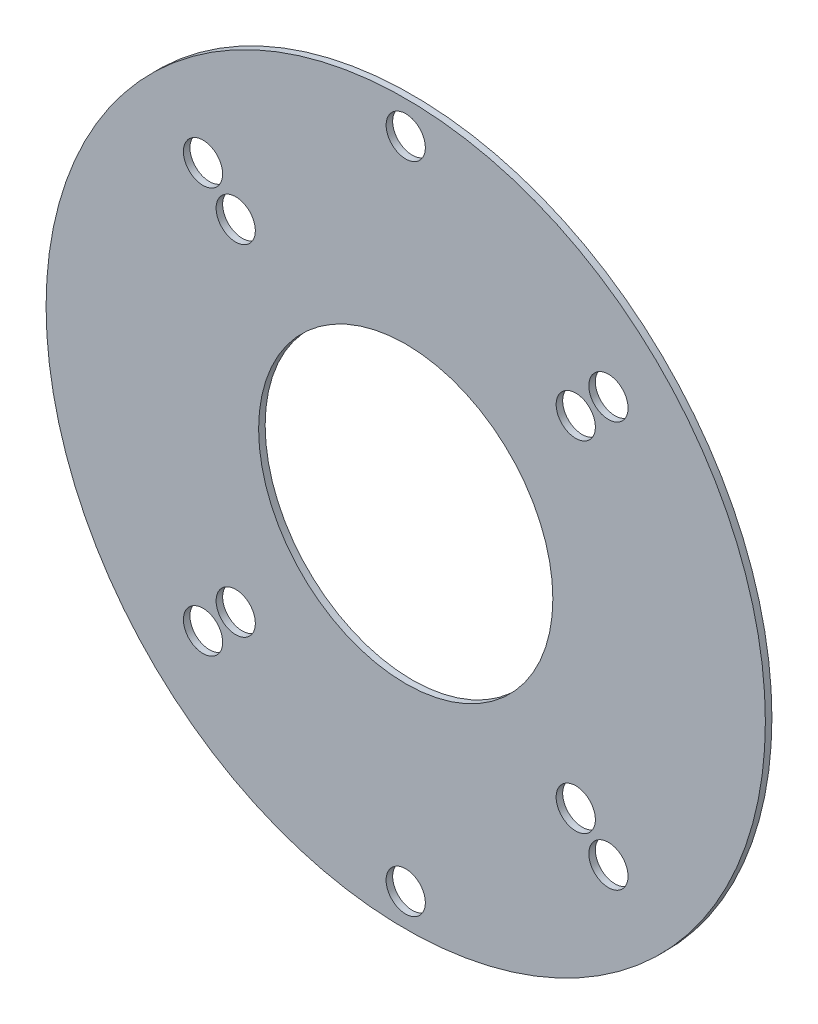
ISO-10303-21;
HEADER;
FILE_DESCRIPTION(('STEP AP214'),'2;1');
FILE_NAME('part.step','',(''),(''),'','','');
FILE_SCHEMA(('AUTOMOTIVE_DESIGN { 1 0 10303 214 1 1 1 1 }'));
ENDSEC;
DATA;
#1=APPLICATION_CONTEXT('core data for automotive mechanical design processes');
#2=APPLICATION_PROTOCOL_DEFINITION('international standard','automotive_design',2000,#1);
#3=PRODUCT_CONTEXT('',#1,'mechanical');
#4=PRODUCT('Part','Part','',(#3));
#5=PRODUCT_RELATED_PRODUCT_CATEGORY('part','',(#4));
#6=PRODUCT_DEFINITION_FORMATION('','',#4);
#7=PRODUCT_DEFINITION_CONTEXT('part definition',#1,'design');
#8=PRODUCT_DEFINITION('design','',#6,#7);
#9=PRODUCT_DEFINITION_SHAPE('','',#8);
#10=(LENGTH_UNIT() NAMED_UNIT(*) SI_UNIT(.MILLI.,.METRE.));
#11=(NAMED_UNIT(*) PLANE_ANGLE_UNIT() SI_UNIT($,.RADIAN.));
#12=(NAMED_UNIT(*) SI_UNIT($,.STERADIAN.) SOLID_ANGLE_UNIT());
#13=UNCERTAINTY_MEASURE_WITH_UNIT(LENGTH_MEASURE(1.E-05),#10,'distance_accuracy_value','');
#14=(GEOMETRIC_REPRESENTATION_CONTEXT(3) GLOBAL_UNCERTAINTY_ASSIGNED_CONTEXT((#13)) GLOBAL_UNIT_ASSIGNED_CONTEXT((#10,
#11,#12)) REPRESENTATION_CONTEXT('',''));
#15=CARTESIAN_POINT('',(0.,0.,0.));
#16=DIRECTION('',(0.,0.,1.));
#17=DIRECTION('',(1.,0.,0.));
#18=AXIS2_PLACEMENT_3D('',#15,#16,#17);
#19=CARTESIAN_POINT('',(0.,0.,-0.5));
#20=DIRECTION('',(0.,0.,1.));
#21=DIRECTION('',(1.,0.,0.));
#22=AXIS2_PLACEMENT_3D('',#19,#20,#21);
#23=PLANE('',#22);
#24=CARTESIAN_POINT('',(0.,-25.,-0.5));
#25=DIRECTION('',(0.,0.,1.));
#26=DIRECTION('',(1.,0.,0.));
#27=AXIS2_PLACEMENT_3D('',#24,#25,#26);
#28=CIRCLE('',#27,1.5);
#29=CARTESIAN_POINT('',(1.5,-25.,-0.5));
#30=VERTEX_POINT('',#29);
#31=EDGE_CURVE('E110',#30,#30,#28,.F.);
#32=ORIENTED_EDGE('',*,*,#31,.F.);
#33=EDGE_LOOP('',(#32));
#34=FACE_BOUND('',#33,.T.);
#35=CARTESIAN_POINT('',(13.,13.,-0.5));
#36=DIRECTION('',(0.,0.,1.));
#37=DIRECTION('',(1.,0.,0.));
#38=AXIS2_PLACEMENT_3D('',#35,#36,#37);
#39=CIRCLE('',#38,1.5);
#40=CARTESIAN_POINT('',(14.5,13.,-0.5));
#41=VERTEX_POINT('',#40);
#42=EDGE_CURVE('E86',#41,#41,#39,.F.);
#43=ORIENTED_EDGE('',*,*,#42,.F.);
#44=EDGE_LOOP('',(#43));
#45=FACE_BOUND('',#44,.T.);
#46=CARTESIAN_POINT('',(0.,0.,-0.5));
#47=DIRECTION('',(0.,0.,1.));
#48=DIRECTION('',(1.,0.,0.));
#49=AXIS2_PLACEMENT_3D('',#46,#47,#48);
#50=CIRCLE('',#49,27.5);
#51=CARTESIAN_POINT('',(27.5,0.,-0.5));
#52=VERTEX_POINT('',#51);
#53=EDGE_CURVE('E11',#52,#52,#50,.T.);
#54=ORIENTED_EDGE('',*,*,#53,.F.);
#55=EDGE_LOOP('',(#54));
#56=FACE_BOUND('',#55,.T.);
#57=CARTESIAN_POINT('',(0.,0.,-0.5));
#58=DIRECTION('',(0.,0.,1.));
#59=DIRECTION('',(1.,0.,0.));
#60=AXIS2_PLACEMENT_3D('',#57,#58,#59);
#61=CIRCLE('',#60,11.25);
#62=CARTESIAN_POINT('',(11.25,0.,-0.5));
#63=VERTEX_POINT('',#62);
#64=EDGE_CURVE('E67',#63,#63,#61,.T.);
#65=ORIENTED_EDGE('',*,*,#64,.T.);
#66=EDGE_LOOP('',(#65));
#67=FACE_BOUND('',#66,.T.);
#68=CARTESIAN_POINT('',(-13.,13.,-0.5));
#69=DIRECTION('',(0.,0.,1.));
#70=DIRECTION('',(1.,0.,0.));
#71=AXIS2_PLACEMENT_3D('',#68,#69,#70);
#72=CIRCLE('',#71,1.5);
#73=CARTESIAN_POINT('',(-11.5,13.,-0.5));
#74=VERTEX_POINT('',#73);
#75=EDGE_CURVE('E74',#74,#74,#72,.T.);
#76=ORIENTED_EDGE('',*,*,#75,.T.);
#77=EDGE_LOOP('',(#76));
#78=FACE_BOUND('',#77,.T.);
#79=CARTESIAN_POINT('',(-13.,-13.,-0.5));
#80=DIRECTION('',(0.,0.,1.));
#81=DIRECTION('',(1.,0.,0.));
#82=AXIS2_PLACEMENT_3D('',#79,#80,#81);
#83=CIRCLE('',#82,1.5);
#84=CARTESIAN_POINT('',(-11.5,-13.,-0.5));
#85=VERTEX_POINT('',#84);
#86=EDGE_CURVE('E80',#85,#85,#83,.F.);
#87=ORIENTED_EDGE('',*,*,#86,.F.);
#88=EDGE_LOOP('',(#87));
#89=FACE_BOUND('',#88,.T.);
#90=CARTESIAN_POINT('',(0.,25.,-0.5));
#91=DIRECTION('',(0.,0.,1.));
#92=DIRECTION('',(1.,0.,0.));
#93=AXIS2_PLACEMENT_3D('',#90,#91,#92);
#94=CIRCLE('',#93,1.5);
#95=CARTESIAN_POINT('',(1.5,25.,-0.5));
#96=VERTEX_POINT('',#95);
#97=EDGE_CURVE('E92',#96,#96,#94,.T.);
#98=ORIENTED_EDGE('',*,*,#97,.T.);
#99=EDGE_LOOP('',(#98));
#100=FACE_BOUND('',#99,.T.);
#101=CARTESIAN_POINT('',(-15.5,15.5,-0.5));
#102=DIRECTION('',(0.,0.,1.));
#103=DIRECTION('',(1.,0.,0.));
#104=AXIS2_PLACEMENT_3D('',#101,#102,#103);
#105=CIRCLE('',#104,1.5);
#106=CARTESIAN_POINT('',(-14.,15.5,-0.5));
#107=VERTEX_POINT('',#106);
#108=EDGE_CURVE('E98',#107,#107,#105,.T.);
#109=ORIENTED_EDGE('',*,*,#108,.T.);
#110=EDGE_LOOP('',(#109));
#111=FACE_BOUND('',#110,.T.);
#112=CARTESIAN_POINT('',(-15.5,-15.5,-0.5));
#113=DIRECTION('',(0.,0.,1.));
#114=DIRECTION('',(1.,0.,0.));
#115=AXIS2_PLACEMENT_3D('',#112,#113,#114);
#116=CIRCLE('',#115,1.5);
#117=CARTESIAN_POINT('',(-14.,-15.5,-0.5));
#118=VERTEX_POINT('',#117);
#119=EDGE_CURVE('E104',#118,#118,#116,.F.);
#120=ORIENTED_EDGE('',*,*,#119,.F.);
#121=EDGE_LOOP('',(#120));
#122=FACE_BOUND('',#121,.T.);
#123=CARTESIAN_POINT('',(13.,-13.,-0.5));
#124=DIRECTION('',(0.,0.,1.));
#125=DIRECTION('',(1.,0.,0.));
#126=AXIS2_PLACEMENT_3D('',#123,#124,#125);
#127=CIRCLE('',#126,1.5);
#128=CARTESIAN_POINT('',(14.5,-13.,-0.5));
#129=VERTEX_POINT('',#128);
#130=EDGE_CURVE('E116',#129,#129,#127,.T.);
#131=ORIENTED_EDGE('',*,*,#130,.T.);
#132=EDGE_LOOP('',(#131));
#133=FACE_BOUND('',#132,.T.);
#134=CARTESIAN_POINT('',(15.5,-15.5,-0.5));
#135=DIRECTION('',(0.,0.,1.));
#136=DIRECTION('',(1.,0.,0.));
#137=AXIS2_PLACEMENT_3D('',#134,#135,#136);
#138=CIRCLE('',#137,1.5);
#139=CARTESIAN_POINT('',(17.,-15.5,-0.5));
#140=VERTEX_POINT('',#139);
#141=EDGE_CURVE('E122',#140,#140,#138,.T.);
#142=ORIENTED_EDGE('',*,*,#141,.T.);
#143=EDGE_LOOP('',(#142));
#144=FACE_BOUND('',#143,.T.);
#145=CARTESIAN_POINT('',(15.5,15.5,-0.5));
#146=DIRECTION('',(0.,0.,1.));
#147=DIRECTION('',(1.,0.,0.));
#148=AXIS2_PLACEMENT_3D('',#145,#146,#147);
#149=CIRCLE('',#148,1.5);
#150=CARTESIAN_POINT('',(17.,15.5,-0.5));
#151=VERTEX_POINT('',#150);
#152=EDGE_CURVE('E128',#151,#151,#149,.F.);
#153=ORIENTED_EDGE('',*,*,#152,.F.);
#154=EDGE_LOOP('',(#153));
#155=FACE_BOUND('',#154,.T.);
#156=ADVANCED_FACE('F56',(#34,#45,#56,#67,#78,#89,#100,#111,#122,#133,#144,#155),#23,.F.);
#157=CARTESIAN_POINT('',(0.,0.,0.));
#158=DIRECTION('',(0.,0.,1.));
#159=DIRECTION('',(1.,0.,0.));
#160=AXIS2_PLACEMENT_3D('',#157,#158,#159);
#161=PLANE('',#160);
#162=CARTESIAN_POINT('',(0.,-25.,0.));
#163=DIRECTION('',(0.,0.,-1.));
#164=DIRECTION('',(-1.,0.,0.));
#165=AXIS2_PLACEMENT_3D('',#162,#163,#164);
#166=CIRCLE('',#165,1.5);
#167=CARTESIAN_POINT('',(-1.5,-25.,0.));
#168=VERTEX_POINT('',#167);
#169=EDGE_CURVE('E113',#168,#168,#166,.T.);
#170=ORIENTED_EDGE('',*,*,#169,.T.);
#171=EDGE_LOOP('',(#170));
#172=FACE_BOUND('',#171,.T.);
#173=CARTESIAN_POINT('',(13.,13.,0.));
#174=DIRECTION('',(0.,0.,1.));
#175=DIRECTION('',(1.,0.,0.));
#176=AXIS2_PLACEMENT_3D('',#173,#174,#175);
#177=CIRCLE('',#176,1.5);
#178=CARTESIAN_POINT('',(14.5,13.,0.));
#179=VERTEX_POINT('',#178);
#180=EDGE_CURVE('E89',#179,#179,#177,.F.);
#181=ORIENTED_EDGE('',*,*,#180,.T.);
#182=EDGE_LOOP('',(#181));
#183=FACE_BOUND('',#182,.T.);
#184=CARTESIAN_POINT('',(0.,0.,0.));
#185=DIRECTION('',(0.,0.,1.));
#186=DIRECTION('',(1.,0.,0.));
#187=AXIS2_PLACEMENT_3D('',#184,#185,#186);
#188=CIRCLE('',#187,27.5);
#189=CARTESIAN_POINT('',(27.5,0.,0.));
#190=VERTEX_POINT('',#189);
#191=EDGE_CURVE('E60',#190,#190,#188,.T.);
#192=ORIENTED_EDGE('',*,*,#191,.T.);
#193=EDGE_LOOP('',(#192));
#194=FACE_BOUND('',#193,.T.);
#195=CARTESIAN_POINT('',(0.,0.,0.));
#196=DIRECTION('',(0.,0.,1.));
#197=DIRECTION('',(1.,0.,0.));
#198=AXIS2_PLACEMENT_3D('',#195,#196,#197);
#199=CIRCLE('',#198,11.25);
#200=CARTESIAN_POINT('',(11.25,0.,0.));
#201=VERTEX_POINT('',#200);
#202=EDGE_CURVE('E71',#201,#201,#199,.T.);
#203=ORIENTED_EDGE('',*,*,#202,.F.);
#204=EDGE_LOOP('',(#203));
#205=FACE_BOUND('',#204,.T.);
#206=CARTESIAN_POINT('',(-13.,13.,0.));
#207=DIRECTION('',(0.,0.,1.));
#208=DIRECTION('',(1.,0.,0.));
#209=AXIS2_PLACEMENT_3D('',#206,#207,#208);
#210=CIRCLE('',#209,1.5);
#211=CARTESIAN_POINT('',(-11.5,13.,0.));
#212=VERTEX_POINT('',#211);
#213=EDGE_CURVE('E77',#212,#212,#210,.T.);
#214=ORIENTED_EDGE('',*,*,#213,.F.);
#215=EDGE_LOOP('',(#214));
#216=FACE_BOUND('',#215,.T.);
#217=CARTESIAN_POINT('',(-13.,-13.,0.));
#218=DIRECTION('',(0.,0.,1.));
#219=DIRECTION('',(1.,0.,0.));
#220=AXIS2_PLACEMENT_3D('',#217,#218,#219);
#221=CIRCLE('',#220,1.5);
#222=CARTESIAN_POINT('',(-11.5,-13.,0.));
#223=VERTEX_POINT('',#222);
#224=EDGE_CURVE('E83',#223,#223,#221,.F.);
#225=ORIENTED_EDGE('',*,*,#224,.T.);
#226=EDGE_LOOP('',(#225));
#227=FACE_BOUND('',#226,.T.);
#228=CARTESIAN_POINT('',(0.,25.,0.));
#229=DIRECTION('',(0.,0.,1.));
#230=DIRECTION('',(1.,0.,0.));
#231=AXIS2_PLACEMENT_3D('',#228,#229,#230);
#232=CIRCLE('',#231,1.5);
#233=CARTESIAN_POINT('',(1.5,25.,0.));
#234=VERTEX_POINT('',#233);
#235=EDGE_CURVE('E95',#234,#234,#232,.T.);
#236=ORIENTED_EDGE('',*,*,#235,.F.);
#237=EDGE_LOOP('',(#236));
#238=FACE_BOUND('',#237,.T.);
#239=CARTESIAN_POINT('',(-15.5,15.5,0.));
#240=DIRECTION('',(0.,0.,1.));
#241=DIRECTION('',(1.,0.,0.));
#242=AXIS2_PLACEMENT_3D('',#239,#240,#241);
#243=CIRCLE('',#242,1.5);
#244=CARTESIAN_POINT('',(-14.,15.5,0.));
#245=VERTEX_POINT('',#244);
#246=EDGE_CURVE('E101',#245,#245,#243,.T.);
#247=ORIENTED_EDGE('',*,*,#246,.F.);
#248=EDGE_LOOP('',(#247));
#249=FACE_BOUND('',#248,.T.);
#250=CARTESIAN_POINT('',(-15.5,-15.5,0.));
#251=DIRECTION('',(0.,0.,-1.));
#252=DIRECTION('',(-1.,0.,0.));
#253=AXIS2_PLACEMENT_3D('',#250,#251,#252);
#254=CIRCLE('',#253,1.5);
#255=CARTESIAN_POINT('',(-17.,-15.5,0.));
#256=VERTEX_POINT('',#255);
#257=EDGE_CURVE('E107',#256,#256,#254,.T.);
#258=ORIENTED_EDGE('',*,*,#257,.T.);
#259=EDGE_LOOP('',(#258));
#260=FACE_BOUND('',#259,.T.);
#261=CARTESIAN_POINT('',(13.,-13.,0.));
#262=DIRECTION('',(0.,0.,1.));
#263=DIRECTION('',(1.,0.,0.));
#264=AXIS2_PLACEMENT_3D('',#261,#262,#263);
#265=CIRCLE('',#264,1.5);
#266=CARTESIAN_POINT('',(14.5,-13.,0.));
#267=VERTEX_POINT('',#266);
#268=EDGE_CURVE('E119',#267,#267,#265,.T.);
#269=ORIENTED_EDGE('',*,*,#268,.F.);
#270=EDGE_LOOP('',(#269));
#271=FACE_BOUND('',#270,.T.);
#272=CARTESIAN_POINT('',(15.5,-15.5,0.));
#273=DIRECTION('',(0.,0.,1.));
#274=DIRECTION('',(1.,0.,0.));
#275=AXIS2_PLACEMENT_3D('',#272,#273,#274);
#276=CIRCLE('',#275,1.5);
#277=CARTESIAN_POINT('',(17.,-15.5,0.));
#278=VERTEX_POINT('',#277);
#279=EDGE_CURVE('E125',#278,#278,#276,.T.);
#280=ORIENTED_EDGE('',*,*,#279,.F.);
#281=EDGE_LOOP('',(#280));
#282=FACE_BOUND('',#281,.T.);
#283=CARTESIAN_POINT('',(15.5,15.5,0.));
#284=DIRECTION('',(0.,0.,-1.));
#285=DIRECTION('',(-1.,0.,0.));
#286=AXIS2_PLACEMENT_3D('',#283,#284,#285);
#287=CIRCLE('',#286,1.5);
#288=CARTESIAN_POINT('',(14.,15.5,0.));
#289=VERTEX_POINT('',#288);
#290=EDGE_CURVE('E131',#289,#289,#287,.T.);
#291=ORIENTED_EDGE('',*,*,#290,.T.);
#292=EDGE_LOOP('',(#291));
#293=FACE_BOUND('',#292,.T.);
#294=ADVANCED_FACE('F135',(#172,#183,#194,#205,#216,#227,#238,#249,#260,#271,#282,#293),#161,.T.);
#295=CARTESIAN_POINT('',(0.,0.,-0.5));
#296=DIRECTION('',(0.,0.,1.));
#297=DIRECTION('',(1.,0.,0.));
#298=AXIS2_PLACEMENT_3D('',#295,#296,#297);
#299=CYLINDRICAL_SURFACE('',#298,27.5);
#300=ORIENTED_EDGE('',*,*,#53,.T.);
#301=EDGE_LOOP('',(#300));
#302=FACE_BOUND('',#301,.T.);
#303=ORIENTED_EDGE('',*,*,#191,.F.);
#304=EDGE_LOOP('',(#303));
#305=FACE_BOUND('',#304,.T.);
#306=ADVANCED_FACE('F58',(#302,#305),#299,.T.);
#307=CARTESIAN_POINT('',(0.,0.,-10.));
#308=DIRECTION('',(0.,0.,1.));
#309=DIRECTION('',(1.,0.,0.));
#310=AXIS2_PLACEMENT_3D('',#307,#308,#309);
#311=CYLINDRICAL_SURFACE('',#310,11.25);
#312=ORIENTED_EDGE('',*,*,#202,.T.);
#313=EDGE_LOOP('',(#312));
#314=FACE_BOUND('',#313,.T.);
#315=ORIENTED_EDGE('',*,*,#64,.F.);
#316=EDGE_LOOP('',(#315));
#317=FACE_BOUND('',#316,.T.);
#318=ADVANCED_FACE('F154',(#314,#317),#311,.F.);
#319=CARTESIAN_POINT('',(-13.,13.,-10.));
#320=DIRECTION('',(0.,0.,1.));
#321=DIRECTION('',(1.,0.,0.));
#322=AXIS2_PLACEMENT_3D('',#319,#320,#321);
#323=CYLINDRICAL_SURFACE('',#322,1.5);
#324=ORIENTED_EDGE('',*,*,#213,.T.);
#325=EDGE_LOOP('',(#324));
#326=FACE_BOUND('',#325,.T.);
#327=ORIENTED_EDGE('',*,*,#75,.F.);
#328=EDGE_LOOP('',(#327));
#329=FACE_BOUND('',#328,.T.);
#330=ADVANCED_FACE('F157',(#326,#329),#323,.F.);
#331=CARTESIAN_POINT('',(-13.,-13.,-10.));
#332=DIRECTION('',(0.,0.,1.));
#333=DIRECTION('',(1.,0.,0.));
#334=AXIS2_PLACEMENT_3D('',#331,#332,#333);
#335=CYLINDRICAL_SURFACE('',#334,1.5);
#336=ORIENTED_EDGE('',*,*,#224,.F.);
#337=EDGE_LOOP('',(#336));
#338=FACE_BOUND('',#337,.T.);
#339=ORIENTED_EDGE('',*,*,#86,.T.);
#340=EDGE_LOOP('',(#339));
#341=FACE_BOUND('',#340,.T.);
#342=ADVANCED_FACE('F161',(#338,#341),#335,.F.);
#343=CARTESIAN_POINT('',(13.,13.,-10.));
#344=DIRECTION('',(0.,0.,1.));
#345=DIRECTION('',(1.,0.,0.));
#346=AXIS2_PLACEMENT_3D('',#343,#344,#345);
#347=CYLINDRICAL_SURFACE('',#346,1.5);
#348=ORIENTED_EDGE('',*,*,#180,.F.);
#349=EDGE_LOOP('',(#348));
#350=FACE_BOUND('',#349,.T.);
#351=ORIENTED_EDGE('',*,*,#42,.T.);
#352=EDGE_LOOP('',(#351));
#353=FACE_BOUND('',#352,.T.);
#354=ADVANCED_FACE('F165',(#350,#353),#347,.F.);
#355=CARTESIAN_POINT('',(0.,25.,-10.));
#356=DIRECTION('',(0.,0.,1.));
#357=DIRECTION('',(1.,0.,0.));
#358=AXIS2_PLACEMENT_3D('',#355,#356,#357);
#359=CYLINDRICAL_SURFACE('',#358,1.5);
#360=ORIENTED_EDGE('',*,*,#235,.T.);
#361=EDGE_LOOP('',(#360));
#362=FACE_BOUND('',#361,.T.);
#363=ORIENTED_EDGE('',*,*,#97,.F.);
#364=EDGE_LOOP('',(#363));
#365=FACE_BOUND('',#364,.T.);
#366=ADVANCED_FACE('F169',(#362,#365),#359,.F.);
#367=CARTESIAN_POINT('',(-15.5,15.5,-10.));
#368=DIRECTION('',(0.,0.,1.));
#369=DIRECTION('',(1.,0.,0.));
#370=AXIS2_PLACEMENT_3D('',#367,#368,#369);
#371=CYLINDRICAL_SURFACE('',#370,1.5);
#372=ORIENTED_EDGE('',*,*,#246,.T.);
#373=EDGE_LOOP('',(#372));
#374=FACE_BOUND('',#373,.T.);
#375=ORIENTED_EDGE('',*,*,#108,.F.);
#376=EDGE_LOOP('',(#375));
#377=FACE_BOUND('',#376,.T.);
#378=ADVANCED_FACE('F173',(#374,#377),#371,.F.);
#379=CARTESIAN_POINT('',(-15.5,-15.5,-10.));
#380=DIRECTION('',(0.,0.,1.));
#381=DIRECTION('',(1.,0.,0.));
#382=AXIS2_PLACEMENT_3D('',#379,#380,#381);
#383=CYLINDRICAL_SURFACE('',#382,1.5);
#384=ORIENTED_EDGE('',*,*,#257,.F.);
#385=EDGE_LOOP('',(#384));
#386=FACE_BOUND('',#385,.T.);
#387=ORIENTED_EDGE('',*,*,#119,.T.);
#388=EDGE_LOOP('',(#387));
#389=FACE_BOUND('',#388,.T.);
#390=ADVANCED_FACE('F177',(#386,#389),#383,.F.);
#391=CARTESIAN_POINT('',(0.,-25.,-10.));
#392=DIRECTION('',(0.,0.,1.));
#393=DIRECTION('',(1.,0.,0.));
#394=AXIS2_PLACEMENT_3D('',#391,#392,#393);
#395=CYLINDRICAL_SURFACE('',#394,1.5);
#396=ORIENTED_EDGE('',*,*,#169,.F.);
#397=EDGE_LOOP('',(#396));
#398=FACE_BOUND('',#397,.T.);
#399=ORIENTED_EDGE('',*,*,#31,.T.);
#400=EDGE_LOOP('',(#399));
#401=FACE_BOUND('',#400,.T.);
#402=ADVANCED_FACE('F181',(#398,#401),#395,.F.);
#403=CARTESIAN_POINT('',(13.,-13.,-10.));
#404=DIRECTION('',(0.,0.,1.));
#405=DIRECTION('',(1.,0.,0.));
#406=AXIS2_PLACEMENT_3D('',#403,#404,#405);
#407=CYLINDRICAL_SURFACE('',#406,1.5);
#408=ORIENTED_EDGE('',*,*,#268,.T.);
#409=EDGE_LOOP('',(#408));
#410=FACE_BOUND('',#409,.T.);
#411=ORIENTED_EDGE('',*,*,#130,.F.);
#412=EDGE_LOOP('',(#411));
#413=FACE_BOUND('',#412,.T.);
#414=ADVANCED_FACE('F185',(#410,#413),#407,.F.);
#415=CARTESIAN_POINT('',(15.5,-15.5,-10.));
#416=DIRECTION('',(0.,0.,1.));
#417=DIRECTION('',(1.,0.,0.));
#418=AXIS2_PLACEMENT_3D('',#415,#416,#417);
#419=CYLINDRICAL_SURFACE('',#418,1.5);
#420=ORIENTED_EDGE('',*,*,#279,.T.);
#421=EDGE_LOOP('',(#420));
#422=FACE_BOUND('',#421,.T.);
#423=ORIENTED_EDGE('',*,*,#141,.F.);
#424=EDGE_LOOP('',(#423));
#425=FACE_BOUND('',#424,.T.);
#426=ADVANCED_FACE('F140',(#422,#425),#419,.F.);
#427=CARTESIAN_POINT('',(15.5,15.5,-10.));
#428=DIRECTION('',(0.,0.,1.));
#429=DIRECTION('',(1.,0.,0.));
#430=AXIS2_PLACEMENT_3D('',#427,#428,#429);
#431=CYLINDRICAL_SURFACE('',#430,1.5);
#432=ORIENTED_EDGE('',*,*,#290,.F.);
#433=EDGE_LOOP('',(#432));
#434=FACE_BOUND('',#433,.T.);
#435=ORIENTED_EDGE('',*,*,#152,.T.);
#436=EDGE_LOOP('',(#435));
#437=FACE_BOUND('',#436,.T.);
#438=ADVANCED_FACE('F137',(#434,#437),#431,.F.);
#439=CLOSED_SHELL('',(#156,#294,#306,#318,#330,#342,#354,#366,#378,#390,#402,#414,#426,#438));
#440=MANIFOLD_SOLID_BREP('B2',#439);
#441=ADVANCED_BREP_SHAPE_REPRESENTATION('',(#18,#440),#14);
#442=SHAPE_DEFINITION_REPRESENTATION(#9,#441);
ENDSEC;
END-ISO-10303-21;
